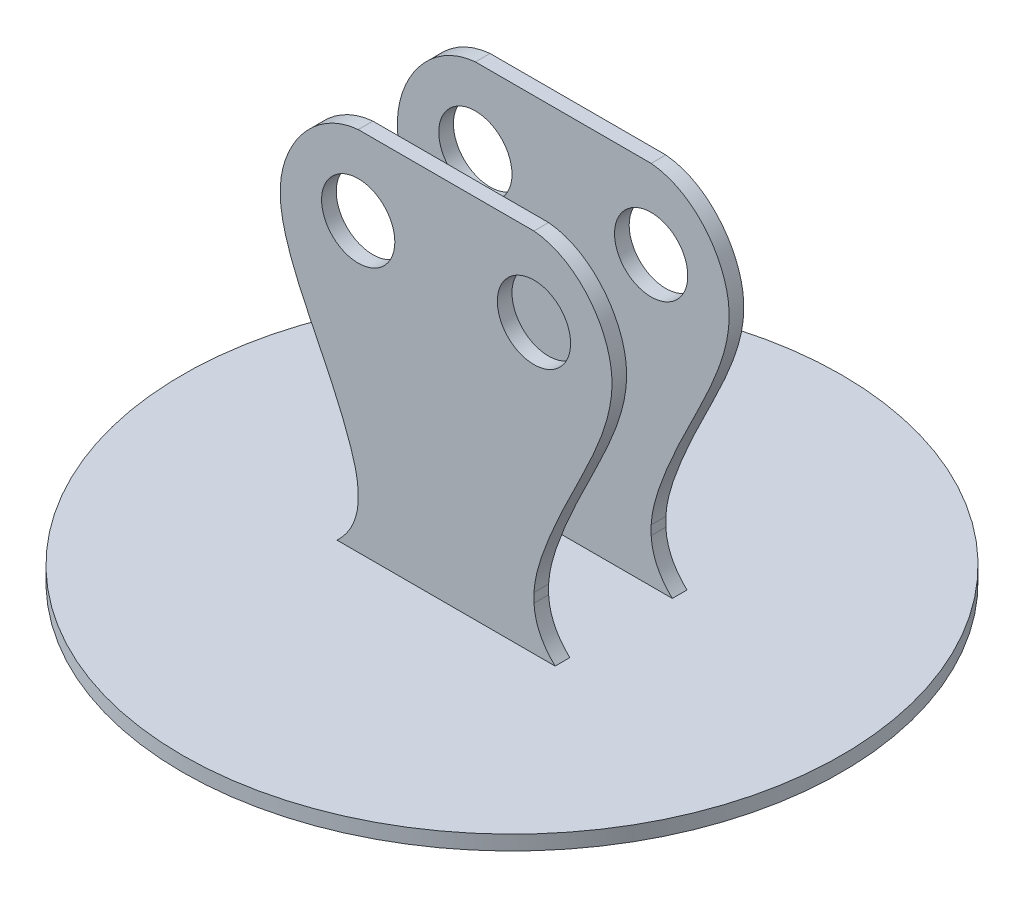
ISO-10303-21;
HEADER;
FILE_DESCRIPTION(('STEP AP214'),'2;1');
FILE_NAME('part.step','',(''),(''),'','','');
FILE_SCHEMA(('AUTOMOTIVE_DESIGN { 1 0 10303 214 1 1 1 1 }'));
ENDSEC;
DATA;
#1=APPLICATION_CONTEXT('core data for automotive mechanical design processes');
#2=APPLICATION_PROTOCOL_DEFINITION('international standard','automotive_design',2000,#1);
#3=PRODUCT_CONTEXT('',#1,'mechanical');
#4=PRODUCT('Part','Part','',(#3));
#5=PRODUCT_RELATED_PRODUCT_CATEGORY('part','',(#4));
#6=PRODUCT_DEFINITION_FORMATION('','',#4);
#7=PRODUCT_DEFINITION_CONTEXT('part definition',#1,'design');
#8=PRODUCT_DEFINITION('design','',#6,#7);
#9=PRODUCT_DEFINITION_SHAPE('','',#8);
#10=(LENGTH_UNIT() NAMED_UNIT(*) SI_UNIT(.MILLI.,.METRE.));
#11=(NAMED_UNIT(*) PLANE_ANGLE_UNIT() SI_UNIT($,.RADIAN.));
#12=(NAMED_UNIT(*) SI_UNIT($,.STERADIAN.) SOLID_ANGLE_UNIT());
#13=UNCERTAINTY_MEASURE_WITH_UNIT(LENGTH_MEASURE(1.E-05),#10,'distance_accuracy_value','');
#14=(GEOMETRIC_REPRESENTATION_CONTEXT(3) GLOBAL_UNCERTAINTY_ASSIGNED_CONTEXT((#13)) GLOBAL_UNIT_ASSIGNED_CONTEXT((#10,
#11,#12)) REPRESENTATION_CONTEXT('',''));
#15=CARTESIAN_POINT('',(0.,0.,0.));
#16=DIRECTION('',(0.,0.,1.));
#17=DIRECTION('',(1.,0.,0.));
#18=AXIS2_PLACEMENT_3D('',#15,#16,#17);
#19=CARTESIAN_POINT('',(0.,2.,0.));
#20=DIRECTION('',(0.,1.,0.));
#21=DIRECTION('',(0.,0.,1.));
#22=AXIS2_PLACEMENT_3D('',#19,#20,#21);
#23=PLANE('',#22);
#24=DIRECTION('',(0.,0.,-1.));
#25=VECTOR('',#24,1.);
#26=CARTESIAN_POINT('',(-14.891007750703,2.,37.4688038063138));
#27=LINE('',#26,#25);
#28=CARTESIAN_POINT('',(-14.891007750703,2.,-7.));
#29=VERTEX_POINT('',#28);
#30=CARTESIAN_POINT('',(-14.891007750703,2.,-9.));
#31=VERTEX_POINT('',#30);
#32=EDGE_CURVE('E63',#29,#31,#27,.T.);
#33=ORIENTED_EDGE('',*,*,#32,.T.);
#34=DIRECTION('',(-1.,0.,0.));
#35=VECTOR('',#34,1.);
#36=CARTESIAN_POINT('',(0.,2.,-9.));
#37=LINE('',#36,#35);
#38=CARTESIAN_POINT('',(14.891007750703,2.,-8.99999999999999));
#39=VERTEX_POINT('',#38);
#40=EDGE_CURVE('E296',#39,#31,#37,.T.);
#41=ORIENTED_EDGE('',*,*,#40,.F.);
#42=DIRECTION('',(0.,0.,-1.));
#43=VECTOR('',#42,1.);
#44=CARTESIAN_POINT('',(14.8910077507029,2.,37.4688038063138));
#45=LINE('',#44,#43);
#46=CARTESIAN_POINT('',(14.891007750703,2.,-6.99999999999999));
#47=VERTEX_POINT('',#46);
#48=EDGE_CURVE('E186',#47,#39,#45,.T.);
#49=ORIENTED_EDGE('',*,*,#48,.F.);
#50=DIRECTION('',(-1.,0.,0.));
#51=VECTOR('',#50,1.);
#52=CARTESIAN_POINT('',(0.,2.,-7.));
#53=LINE('',#52,#51);
#54=EDGE_CURVE('E58',#47,#29,#53,.T.);
#55=ORIENTED_EDGE('',*,*,#54,.T.);
#56=EDGE_LOOP('',(#33,#41,#49,#55));
#57=FACE_BOUND('',#56,.T.);
#58=CARTESIAN_POINT('',(0.,2.,0.));
#59=DIRECTION('',(0.,1.,0.));
#60=DIRECTION('',(0.,0.,1.));
#61=AXIS2_PLACEMENT_3D('',#58,#59,#60);
#62=CIRCLE('',#61,45.);
#63=CARTESIAN_POINT('',(0.,2.,45.));
#64=VERTEX_POINT('',#63);
#65=EDGE_CURVE('E11',#64,#64,#62,.T.);
#66=ORIENTED_EDGE('',*,*,#65,.T.);
#67=EDGE_LOOP('',(#66));
#68=FACE_BOUND('',#67,.T.);
#69=DIRECTION('',(-1.,0.,0.));
#70=VECTOR('',#69,1.);
#71=CARTESIAN_POINT('',(0.,2.,7.));
#72=LINE('',#71,#70);
#73=CARTESIAN_POINT('',(14.891007750703,2.,6.99999999999999));
#74=VERTEX_POINT('',#73);
#75=CARTESIAN_POINT('',(-14.891007750703,2.,7.));
#76=VERTEX_POINT('',#75);
#77=EDGE_CURVE('E454',#74,#76,#72,.T.);
#78=ORIENTED_EDGE('',*,*,#77,.F.);
#79=DIRECTION('',(0.,0.,1.));
#80=VECTOR('',#79,1.);
#81=CARTESIAN_POINT('',(14.8910077507029,2.,-37.4688038063138));
#82=LINE('',#81,#80);
#83=CARTESIAN_POINT('',(14.891007750703,2.,8.99999999999999));
#84=VERTEX_POINT('',#83);
#85=EDGE_CURVE('E356',#74,#84,#82,.T.);
#86=ORIENTED_EDGE('',*,*,#85,.T.);
#87=DIRECTION('',(-1.,0.,0.));
#88=VECTOR('',#87,1.);
#89=CARTESIAN_POINT('',(0.,2.,9.));
#90=LINE('',#89,#88);
#91=CARTESIAN_POINT('',(-14.891007750703,2.,9.));
#92=VERTEX_POINT('',#91);
#93=EDGE_CURVE('E447',#84,#92,#90,.T.);
#94=ORIENTED_EDGE('',*,*,#93,.T.);
#95=DIRECTION('',(0.,0.,1.));
#96=VECTOR('',#95,1.);
#97=CARTESIAN_POINT('',(-14.891007750703,2.,-37.4688038063138));
#98=LINE('',#97,#96);
#99=EDGE_CURVE('E428',#76,#92,#98,.T.);
#100=ORIENTED_EDGE('',*,*,#99,.F.);
#101=EDGE_LOOP('',(#78,#86,#94,#100));
#102=FACE_BOUND('',#101,.T.);
#103=ADVANCED_FACE('F43',(#57,#68,#102),#23,.T.);
#104=CARTESIAN_POINT('',(0.,2.,0.));
#105=DIRECTION('',(0.,-1.,0.));
#106=DIRECTION('',(0.,0.,-1.));
#107=AXIS2_PLACEMENT_3D('',#104,#105,#106);
#108=CYLINDRICAL_SURFACE('',#107,45.);
#109=ORIENTED_EDGE('',*,*,#65,.F.);
#110=EDGE_LOOP('',(#109));
#111=FACE_BOUND('',#110,.T.);
#112=CARTESIAN_POINT('',(0.,0.,0.));
#113=DIRECTION('',(0.,1.,0.));
#114=DIRECTION('',(0.,0.,1.));
#115=AXIS2_PLACEMENT_3D('',#112,#113,#114);
#116=CIRCLE('',#115,45.);
#117=CARTESIAN_POINT('',(0.,0.,45.));
#118=VERTEX_POINT('',#117);
#119=EDGE_CURVE('E47',#118,#118,#116,.T.);
#120=ORIENTED_EDGE('',*,*,#119,.T.);
#121=EDGE_LOOP('',(#120));
#122=FACE_BOUND('',#121,.T.);
#123=ADVANCED_FACE('F45',(#111,#122),#108,.T.);
#124=CARTESIAN_POINT('',(0.,0.,0.));
#125=DIRECTION('',(0.,1.,0.));
#126=DIRECTION('',(0.,0.,1.));
#127=AXIS2_PLACEMENT_3D('',#124,#125,#126);
#128=PLANE('',#127);
#129=ORIENTED_EDGE('',*,*,#119,.F.);
#130=EDGE_LOOP('',(#129));
#131=FACE_BOUND('',#130,.T.);
#132=ADVANCED_FACE('F468',(#131),#128,.F.);
#133=CARTESIAN_POINT('',(0.,52.,7.));
#134=DIRECTION('',(0.,0.,1.));
#135=DIRECTION('',(1.,0.,0.));
#136=AXIS2_PLACEMENT_3D('',#133,#134,#135);
#137=PLANE('',#136);
#138=CARTESIAN_POINT('',(-12.,41.2016468073082,7.));
#139=DIRECTION('',(0.,0.,1.));
#140=DIRECTION('',(1.,0.,0.));
#141=AXIS2_PLACEMENT_3D('',#138,#139,#140);
#142=CIRCLE('',#141,5.);
#143=CARTESIAN_POINT('',(-7.,41.2016468073082,7.));
#144=VERTEX_POINT('',#143);
#145=EDGE_CURVE('E384',#144,#144,#142,.T.);
#146=ORIENTED_EDGE('',*,*,#145,.T.);
#147=EDGE_LOOP('',(#146));
#148=FACE_BOUND('',#147,.T.);
#149=ORIENTED_EDGE('',*,*,#77,.T.);
#150=CARTESIAN_POINT('',(-12.,52.,7.));
#151=CARTESIAN_POINT('',(-17.7076082734,51.5000795332923,7.));
#152=CARTESIAN_POINT('',(-24.2528807765385,43.2597323463657,7.));
#153=CARTESIAN_POINT('',(-21.3975400761616,31.962524142188,7.));
#154=CARTESIAN_POINT('',(-17.3388050300587,23.9745086455927,7.));
#155=CARTESIAN_POINT('',(-12.6520814833312,14.2021610637252,7.));
#156=CARTESIAN_POINT('',(-10.6555339458755,6.01314104208462,7.));
#157=CARTESIAN_POINT('',(-14.891007750703,2.,7.));
#158=B_SPLINE_CURVE_WITH_KNOTS('',3,(#150,#151,#152,#153,#154,#155,#156,#157),.UNSPECIFIED.,.F.,
.F.,(4,1,1,1,1,4),(0.,0.287980079795971,0.430455664091535,0.586456404950871,0.756216635006292,
1.),.UNSPECIFIED.);
#159=CARTESIAN_POINT('',(-12.,7.97972563222294,7.));
#160=VERTEX_POINT('',#159);
#161=EDGE_CURVE('E434',#76,#160,#158,.F.);
#162=ORIENTED_EDGE('',*,*,#161,.T.);
#163=DIRECTION('',(0.,-1.,0.));
#164=VECTOR('',#163,1.);
#165=CARTESIAN_POINT('',(-12.,52.,7.));
#166=LINE('',#165,#164);
#167=CARTESIAN_POINT('',(-12.,9.25258575492129,7.));
#168=VERTEX_POINT('',#167);
#169=EDGE_CURVE('E459',#168,#160,#166,.T.);
#170=ORIENTED_EDGE('',*,*,#169,.F.);
#171=CARTESIAN_POINT('',(-12.,52.,7.));
#172=CARTESIAN_POINT('',(-17.7076082734,51.5000795332923,7.));
#173=CARTESIAN_POINT('',(-24.2528807765385,43.2597323463657,7.));
#174=CARTESIAN_POINT('',(-21.3975400761616,31.962524142188,7.));
#175=CARTESIAN_POINT('',(-17.3388050300587,23.9745086455927,7.));
#176=CARTESIAN_POINT('',(-12.6520814833312,14.2021610637252,7.));
#177=CARTESIAN_POINT('',(-10.6555339458755,6.01314104208462,7.));
#178=CARTESIAN_POINT('',(-14.891007750703,2.,7.));
#179=B_SPLINE_CURVE_WITH_KNOTS('',3,(#171,#172,#173,#174,#175,#176,#177,#178),.UNSPECIFIED.,.F.,
.F.,(4,1,1,1,1,4),(0.,0.287980079795971,0.430455664091535,0.586456404950871,0.756216635006292,
1.),.UNSPECIFIED.);
#180=CARTESIAN_POINT('',(-12.,52.,7.));
#181=VERTEX_POINT('',#180);
#182=EDGE_CURVE('E417',#168,#181,#179,.F.);
#183=ORIENTED_EDGE('',*,*,#182,.T.);
#184=DIRECTION('',(-1.,0.,0.));
#185=VECTOR('',#184,1.);
#186=CARTESIAN_POINT('',(0.,52.,7.));
#187=LINE('',#186,#185);
#188=CARTESIAN_POINT('',(12.,52.,7.));
#189=VERTEX_POINT('',#188);
#190=EDGE_CURVE('E440',#189,#181,#187,.T.);
#191=ORIENTED_EDGE('',*,*,#190,.F.);
#192=CARTESIAN_POINT('',(12.,52.,7.));
#193=CARTESIAN_POINT('',(17.7076082734,51.5000795332923,6.99999999999999));
#194=CARTESIAN_POINT('',(24.2528807765385,43.2597323463657,6.99999999999999));
#195=CARTESIAN_POINT('',(21.3975400761616,31.962524142188,6.99999999999999));
#196=CARTESIAN_POINT('',(17.3388050300587,23.9745086455927,6.99999999999999));
#197=CARTESIAN_POINT('',(12.6520814833312,14.2021610637252,7.));
#198=CARTESIAN_POINT('',(10.6555339458755,6.01314104208462,7.));
#199=CARTESIAN_POINT('',(14.891007750703,2.,7.));
#200=B_SPLINE_CURVE_WITH_KNOTS('',3,(#192,#193,#194,#195,#196,#197,#198,#199),.UNSPECIFIED.,.F.,
.F.,(4,1,1,1,1,4),(0.,0.287980079795971,0.430455664091535,0.586456404950871,0.756216635006292,
1.),.UNSPECIFIED.);
#201=CARTESIAN_POINT('',(12.,9.25258575492129,7.));
#202=VERTEX_POINT('',#201);
#203=EDGE_CURVE('E345',#202,#189,#200,.F.);
#204=ORIENTED_EDGE('',*,*,#203,.F.);
#205=DIRECTION('',(0.,-1.,0.));
#206=VECTOR('',#205,1.);
#207=CARTESIAN_POINT('',(12.,52.,7.));
#208=LINE('',#207,#206);
#209=CARTESIAN_POINT('',(12.,7.97972563222294,7.));
#210=VERTEX_POINT('',#209);
#211=EDGE_CURVE('E378',#202,#210,#208,.T.);
#212=ORIENTED_EDGE('',*,*,#211,.T.);
#213=CARTESIAN_POINT('',(12.,52.,7.));
#214=CARTESIAN_POINT('',(17.7076082734,51.5000795332923,6.99999999999999));
#215=CARTESIAN_POINT('',(24.2528807765385,43.2597323463657,6.99999999999999));
#216=CARTESIAN_POINT('',(21.3975400761616,31.962524142188,6.99999999999999));
#217=CARTESIAN_POINT('',(17.3388050300587,23.9745086455927,6.99999999999999));
#218=CARTESIAN_POINT('',(12.6520814833312,14.2021610637252,7.));
#219=CARTESIAN_POINT('',(10.6555339458755,6.01314104208462,7.));
#220=CARTESIAN_POINT('',(14.891007750703,2.,7.));
#221=B_SPLINE_CURVE_WITH_KNOTS('',3,(#213,#214,#215,#216,#217,#218,#219,#220),.UNSPECIFIED.,.F.,
.F.,(4,1,1,1,1,4),(0.,0.287980079795971,0.430455664091535,0.586456404950871,0.756216635006292,
1.),.UNSPECIFIED.);
#222=EDGE_CURVE('E362',#74,#210,#221,.F.);
#223=ORIENTED_EDGE('',*,*,#222,.F.);
#224=EDGE_LOOP('',(#149,#162,#170,#183,#191,#204,#212,#223));
#225=FACE_BOUND('',#224,.T.);
#226=CARTESIAN_POINT('',(12.,41.2016468073082,7.));
#227=DIRECTION('',(0.,0.,-1.));
#228=DIRECTION('',(-1.,0.,0.));
#229=AXIS2_PLACEMENT_3D('',#226,#227,#228);
#230=CIRCLE('',#229,5.);
#231=CARTESIAN_POINT('',(7.,41.2016468073082,7.));
#232=VERTEX_POINT('',#231);
#233=EDGE_CURVE('E310',#232,#232,#230,.T.);
#234=ORIENTED_EDGE('',*,*,#233,.F.);
#235=EDGE_LOOP('',(#234));
#236=FACE_BOUND('',#235,.T.);
#237=ADVANCED_FACE('F470',(#148,#225,#236),#137,.F.);
#238=CARTESIAN_POINT('',(-12.,52.,0.));
#239=DIRECTION('',(1.,0.,0.));
#240=DIRECTION('',(0.,0.,-1.));
#241=AXIS2_PLACEMENT_3D('',#238,#239,#240);
#242=PLANE('',#241);
#243=DIRECTION('',(0.,-1.,0.));
#244=VECTOR('',#243,1.);
#245=CARTESIAN_POINT('',(-12.,52.,9.));
#246=LINE('',#245,#244);
#247=CARTESIAN_POINT('',(-12.,9.25258575492129,9.));
#248=VERTEX_POINT('',#247);
#249=CARTESIAN_POINT('',(-12.,7.97972563222292,9.));
#250=VERTEX_POINT('',#249);
#251=EDGE_CURVE('E453',#248,#250,#246,.T.);
#252=ORIENTED_EDGE('',*,*,#251,.F.);
#253=DIRECTION('',(0.,0.,1.));
#254=VECTOR('',#253,1.);
#255=CARTESIAN_POINT('',(-12.,9.25258575492129,-37.4688038063138));
#256=LINE('',#255,#254);
#257=EDGE_CURVE('E772',#168,#248,#256,.T.);
#258=ORIENTED_EDGE('',*,*,#257,.F.);
#259=ORIENTED_EDGE('',*,*,#169,.T.);
#260=DIRECTION('',(0.,0.,1.));
#261=VECTOR('',#260,1.);
#262=CARTESIAN_POINT('',(-12.,7.97972563222292,-37.4688038063138));
#263=LINE('',#262,#261);
#264=EDGE_CURVE('E427',#160,#250,#263,.T.);
#265=ORIENTED_EDGE('',*,*,#264,.T.);
#266=EDGE_LOOP('',(#252,#258,#259,#265));
#267=FACE_BOUND('',#266,.T.);
#268=ADVANCED_FACE('F475',(#267),#242,.F.);
#269=CARTESIAN_POINT('',(0.,52.,9.));
#270=DIRECTION('',(0.,0.,1.));
#271=DIRECTION('',(1.,0.,0.));
#272=AXIS2_PLACEMENT_3D('',#269,#270,#271);
#273=PLANE('',#272);
#274=CARTESIAN_POINT('',(-12.,41.2016468073082,9.));
#275=DIRECTION('',(0.,0.,1.));
#276=DIRECTION('',(1.,0.,0.));
#277=AXIS2_PLACEMENT_3D('',#274,#275,#276);
#278=CIRCLE('',#277,5.);
#279=CARTESIAN_POINT('',(-7.,41.2016468073082,9.));
#280=VERTEX_POINT('',#279);
#281=EDGE_CURVE('E381',#280,#280,#278,.T.);
#282=ORIENTED_EDGE('',*,*,#281,.F.);
#283=EDGE_LOOP('',(#282));
#284=FACE_BOUND('',#283,.T.);
#285=ORIENTED_EDGE('',*,*,#93,.F.);
#286=CARTESIAN_POINT('',(12.,52.,9.));
#287=CARTESIAN_POINT('',(17.7076082734,51.5000795332923,9.));
#288=CARTESIAN_POINT('',(24.2528807765385,43.2597323463657,9.));
#289=CARTESIAN_POINT('',(21.3975400761616,31.962524142188,9.));
#290=CARTESIAN_POINT('',(17.3388050300587,23.9745086455927,9.));
#291=CARTESIAN_POINT('',(12.6520814833312,14.2021610637252,9.));
#292=CARTESIAN_POINT('',(10.6555339458755,6.01314104208462,9.));
#293=CARTESIAN_POINT('',(14.891007750703,2.,9.));
#294=B_SPLINE_CURVE_WITH_KNOTS('',3,(#286,#287,#288,#289,#290,#291,#292,#293),.UNSPECIFIED.,.F.,
.F.,(4,1,1,1,1,4),(0.,0.287980079795971,0.430455664091535,0.586456404950871,0.756216635006292,
1.),.UNSPECIFIED.);
#295=CARTESIAN_POINT('',(12.,7.97972563222292,9.));
#296=VERTEX_POINT('',#295);
#297=EDGE_CURVE('E313',#296,#84,#294,.T.);
#298=ORIENTED_EDGE('',*,*,#297,.F.);
#299=DIRECTION('',(0.,-1.,0.));
#300=VECTOR('',#299,1.);
#301=CARTESIAN_POINT('',(12.,52.,9.));
#302=LINE('',#301,#300);
#303=CARTESIAN_POINT('',(12.,9.25258575492129,9.));
#304=VERTEX_POINT('',#303);
#305=EDGE_CURVE('E375',#304,#296,#302,.T.);
#306=ORIENTED_EDGE('',*,*,#305,.F.);
#307=CARTESIAN_POINT('',(12.,52.,9.));
#308=CARTESIAN_POINT('',(17.7076082734,51.5000795332923,9.));
#309=CARTESIAN_POINT('',(24.2528807765385,43.2597323463657,9.));
#310=CARTESIAN_POINT('',(21.3975400761616,31.962524142188,9.));
#311=CARTESIAN_POINT('',(17.3388050300587,23.9745086455927,9.));
#312=CARTESIAN_POINT('',(12.6520814833312,14.2021610637252,9.));
#313=CARTESIAN_POINT('',(10.6555339458755,6.01314104208462,9.));
#314=CARTESIAN_POINT('',(14.891007750703,2.,9.));
#315=B_SPLINE_CURVE_WITH_KNOTS('',3,(#307,#308,#309,#310,#311,#312,#313,#314),.UNSPECIFIED.,.F.,
.F.,(4,1,1,1,1,4),(0.,0.287980079795971,0.430455664091535,0.586456404950871,0.756216635006292,
1.),.UNSPECIFIED.);
#316=CARTESIAN_POINT('',(12.,52.,9.));
#317=VERTEX_POINT('',#316);
#318=EDGE_CURVE('E318',#317,#304,#315,.T.);
#319=ORIENTED_EDGE('',*,*,#318,.F.);
#320=DIRECTION('',(-1.,0.,0.));
#321=VECTOR('',#320,1.);
#322=CARTESIAN_POINT('',(0.,52.,9.));
#323=LINE('',#322,#321);
#324=CARTESIAN_POINT('',(-12.,52.,9.));
#325=VERTEX_POINT('',#324);
#326=EDGE_CURVE('E450',#317,#325,#323,.T.);
#327=ORIENTED_EDGE('',*,*,#326,.T.);
#328=CARTESIAN_POINT('',(-12.,52.,9.));
#329=CARTESIAN_POINT('',(-17.7076082734,51.5000795332923,9.));
#330=CARTESIAN_POINT('',(-24.2528807765385,43.2597323463657,9.));
#331=CARTESIAN_POINT('',(-21.3975400761616,31.962524142188,9.));
#332=CARTESIAN_POINT('',(-17.3388050300587,23.9745086455927,9.));
#333=CARTESIAN_POINT('',(-12.6520814833312,14.2021610637252,9.));
#334=CARTESIAN_POINT('',(-10.6555339458755,6.01314104208462,9.));
#335=CARTESIAN_POINT('',(-14.891007750703,2.,9.));
#336=B_SPLINE_CURVE_WITH_KNOTS('',3,(#328,#329,#330,#331,#332,#333,#334,#335),.UNSPECIFIED.,.F.,
.F.,(4,1,1,1,1,4),(0.,0.287980079795971,0.430455664091535,0.586456404950871,0.756216635006292,
1.),.UNSPECIFIED.);
#337=EDGE_CURVE('E392',#325,#248,#336,.T.);
#338=ORIENTED_EDGE('',*,*,#337,.T.);
#339=ORIENTED_EDGE('',*,*,#251,.T.);
#340=CARTESIAN_POINT('',(-12.,52.,9.));
#341=CARTESIAN_POINT('',(-17.7076082734,51.5000795332923,9.));
#342=CARTESIAN_POINT('',(-24.2528807765385,43.2597323463657,9.));
#343=CARTESIAN_POINT('',(-21.3975400761616,31.962524142188,9.));
#344=CARTESIAN_POINT('',(-17.3388050300587,23.9745086455927,9.));
#345=CARTESIAN_POINT('',(-12.6520814833312,14.2021610637252,9.));
#346=CARTESIAN_POINT('',(-10.6555339458755,6.01314104208462,9.));
#347=CARTESIAN_POINT('',(-14.891007750703,2.,9.));
#348=B_SPLINE_CURVE_WITH_KNOTS('',3,(#340,#341,#342,#343,#344,#345,#346,#347),.UNSPECIFIED.,.F.,
.F.,(4,1,1,1,1,4),(0.,0.287980079795971,0.430455664091535,0.586456404950871,0.756216635006292,
1.),.UNSPECIFIED.);
#349=EDGE_CURVE('E387',#250,#92,#348,.T.);
#350=ORIENTED_EDGE('',*,*,#349,.T.);
#351=EDGE_LOOP('',(#285,#298,#306,#319,#327,#338,#339,#350));
#352=FACE_BOUND('',#351,.T.);
#353=CARTESIAN_POINT('',(12.,41.2016468073082,9.));
#354=DIRECTION('',(0.,0.,-1.));
#355=DIRECTION('',(-1.,0.,0.));
#356=AXIS2_PLACEMENT_3D('',#353,#354,#355);
#357=CIRCLE('',#356,5.);
#358=CARTESIAN_POINT('',(7.,41.2016468073082,9.));
#359=VERTEX_POINT('',#358);
#360=EDGE_CURVE('E307',#359,#359,#357,.T.);
#361=ORIENTED_EDGE('',*,*,#360,.T.);
#362=EDGE_LOOP('',(#361));
#363=FACE_BOUND('',#362,.T.);
#364=ADVANCED_FACE('F489',(#284,#352,#363),#273,.T.);
#365=CARTESIAN_POINT('',(0.,52.,0.));
#366=DIRECTION('',(0.,1.,0.));
#367=DIRECTION('',(0.,0.,1.));
#368=AXIS2_PLACEMENT_3D('',#365,#366,#367);
#369=PLANE('',#368);
#370=ORIENTED_EDGE('',*,*,#190,.T.);
#371=DIRECTION('',(0.,0.,1.));
#372=VECTOR('',#371,1.);
#373=CARTESIAN_POINT('',(-12.,52.,0.));
#374=LINE('',#373,#372);
#375=EDGE_CURVE('E446',#181,#325,#374,.T.);
#376=ORIENTED_EDGE('',*,*,#375,.T.);
#377=ORIENTED_EDGE('',*,*,#326,.F.);
#378=DIRECTION('',(0.,0.,1.));
#379=VECTOR('',#378,1.);
#380=CARTESIAN_POINT('',(12.,52.,0.));
#381=LINE('',#380,#379);
#382=EDGE_CURVE('E369',#189,#317,#381,.T.);
#383=ORIENTED_EDGE('',*,*,#382,.F.);
#384=EDGE_LOOP('',(#370,#376,#377,#383));
#385=FACE_BOUND('',#384,.T.);
#386=ADVANCED_FACE('F404',(#385),#369,.T.);
#387=CARTESIAN_POINT('',(-12.,52.,-37.4688038063138));
#388=CARTESIAN_POINT('',(-17.7076082734,51.5000795332923,-37.4688038063138));
#389=CARTESIAN_POINT('',(-24.2528807765385,43.2597323463657,-37.4688038063138));
#390=CARTESIAN_POINT('',(-21.3975400761616,31.962524142188,-37.4688038063138));
#391=CARTESIAN_POINT('',(-17.3388050300587,23.9745086455927,-37.4688038063138));
#392=CARTESIAN_POINT('',(-12.6520814833312,14.2021610637252,-37.4688038063138));
#393=CARTESIAN_POINT('',(-10.6555339458755,6.01314104208462,-37.4688038063138));
#394=CARTESIAN_POINT('',(-14.891007750703,2.,-37.4688038063138));
#395=B_SPLINE_CURVE_WITH_KNOTS('',3,(#387,#388,#389,#390,#391,#392,#393,#394),.UNSPECIFIED.,.F.,
.F.,(4,1,1,1,1,4),(0.,0.287980079795971,0.430455664091535,0.586456404950871,0.756216635006292,
1.),.UNSPECIFIED.);
#396=DIRECTION('',(0.,0.,1.));
#397=VECTOR('',#396,1.);
#398=SURFACE_OF_LINEAR_EXTRUSION('',#395,#397);
#399=ORIENTED_EDGE('',*,*,#182,.F.);
#400=ORIENTED_EDGE('',*,*,#257,.T.);
#401=ORIENTED_EDGE('',*,*,#337,.F.);
#402=ORIENTED_EDGE('',*,*,#375,.F.);
#403=EDGE_LOOP('',(#399,#400,#401,#402));
#404=FACE_BOUND('',#403,.T.);
#405=ADVANCED_FACE('F400',(#404),#398,.T.);
#406=CARTESIAN_POINT('',(-12.,52.,-37.4688038063138));
#407=CARTESIAN_POINT('',(-17.7076082734,51.5000795332923,-37.4688038063138));
#408=CARTESIAN_POINT('',(-24.2528807765385,43.2597323463657,-37.4688038063138));
#409=CARTESIAN_POINT('',(-21.3975400761616,31.962524142188,-37.4688038063138));
#410=CARTESIAN_POINT('',(-17.3388050300587,23.9745086455927,-37.4688038063138));
#411=CARTESIAN_POINT('',(-12.6520814833312,14.2021610637252,-37.4688038063138));
#412=CARTESIAN_POINT('',(-10.6555339458755,6.01314104208462,-37.4688038063138));
#413=CARTESIAN_POINT('',(-14.891007750703,2.,-37.4688038063138));
#414=B_SPLINE_CURVE_WITH_KNOTS('',3,(#406,#407,#408,#409,#410,#411,#412,#413),.UNSPECIFIED.,.F.,
.F.,(4,1,1,1,1,4),(0.,0.287980079795971,0.430455664091535,0.586456404950871,0.756216635006292,
1.),.UNSPECIFIED.);
#415=DIRECTION('',(0.,0.,1.));
#416=VECTOR('',#415,1.);
#417=SURFACE_OF_LINEAR_EXTRUSION('',#414,#416);
#418=ORIENTED_EDGE('',*,*,#161,.F.);
#419=ORIENTED_EDGE('',*,*,#99,.T.);
#420=ORIENTED_EDGE('',*,*,#349,.F.);
#421=ORIENTED_EDGE('',*,*,#264,.F.);
#422=EDGE_LOOP('',(#418,#419,#420,#421));
#423=FACE_BOUND('',#422,.T.);
#424=ADVANCED_FACE('F403',(#423),#417,.T.);
#425=CARTESIAN_POINT('',(-12.,41.2016468073082,-41.));
#426=DIRECTION('',(0.,0.,1.));
#427=DIRECTION('',(1.,0.,0.));
#428=AXIS2_PLACEMENT_3D('',#425,#426,#427);
#429=CYLINDRICAL_SURFACE('',#428,5.);
#430=ORIENTED_EDGE('',*,*,#281,.T.);
#431=EDGE_LOOP('',(#430));
#432=FACE_BOUND('',#431,.T.);
#433=ORIENTED_EDGE('',*,*,#145,.F.);
#434=EDGE_LOOP('',(#433));
#435=FACE_BOUND('',#434,.T.);
#436=ADVANCED_FACE('F406',(#432,#435),#429,.F.);
#437=CARTESIAN_POINT('',(12.,52.,0.));
#438=DIRECTION('',(-1.,0.,0.));
#439=DIRECTION('',(0.,0.,-1.));
#440=AXIS2_PLACEMENT_3D('',#437,#438,#439);
#441=PLANE('',#440);
#442=ORIENTED_EDGE('',*,*,#305,.T.);
#443=DIRECTION('',(0.,0.,1.));
#444=VECTOR('',#443,1.);
#445=CARTESIAN_POINT('',(12.,7.97972563222292,-37.4688038063138));
#446=LINE('',#445,#444);
#447=EDGE_CURVE('E355',#210,#296,#446,.T.);
#448=ORIENTED_EDGE('',*,*,#447,.F.);
#449=ORIENTED_EDGE('',*,*,#211,.F.);
#450=DIRECTION('',(0.,0.,1.));
#451=VECTOR('',#450,1.);
#452=CARTESIAN_POINT('',(12.,9.25258575492129,-37.4688038063138));
#453=LINE('',#452,#451);
#454=EDGE_CURVE('E765',#202,#304,#453,.T.);
#455=ORIENTED_EDGE('',*,*,#454,.T.);
#456=EDGE_LOOP('',(#442,#448,#449,#455));
#457=FACE_BOUND('',#456,.T.);
#458=ADVANCED_FACE('F331',(#457),#441,.F.);
#459=CARTESIAN_POINT('',(12.,52.,-37.4688038063138));
#460=CARTESIAN_POINT('',(17.7076082734,51.5000795332923,-37.4688038063138));
#461=CARTESIAN_POINT('',(24.2528807765385,43.2597323463657,-37.4688038063138));
#462=CARTESIAN_POINT('',(21.3975400761616,31.962524142188,-37.4688038063138));
#463=CARTESIAN_POINT('',(17.3388050300587,23.9745086455927,-37.4688038063138));
#464=CARTESIAN_POINT('',(12.6520814833312,14.2021610637252,-37.4688038063138));
#465=CARTESIAN_POINT('',(10.6555339458755,6.01314104208462,-37.4688038063138));
#466=CARTESIAN_POINT('',(14.8910077507029,2.,-37.4688038063138));
#467=B_SPLINE_CURVE_WITH_KNOTS('',3,(#459,#460,#461,#462,#463,#464,#465,#466),.UNSPECIFIED.,.F.,
.F.,(4,1,1,1,1,4),(0.,0.287980079795971,0.430455664091535,0.586456404950871,0.756216635006292,
1.),.UNSPECIFIED.);
#468=DIRECTION('',(0.,0.,1.));
#469=VECTOR('',#468,1.);
#470=SURFACE_OF_LINEAR_EXTRUSION('',#467,#469);
#471=ORIENTED_EDGE('',*,*,#203,.T.);
#472=ORIENTED_EDGE('',*,*,#382,.T.);
#473=ORIENTED_EDGE('',*,*,#318,.T.);
#474=ORIENTED_EDGE('',*,*,#454,.F.);
#475=EDGE_LOOP('',(#471,#472,#473,#474));
#476=FACE_BOUND('',#475,.T.);
#477=ADVANCED_FACE('F326',(#476),#470,.F.);
#478=CARTESIAN_POINT('',(12.,52.,-37.4688038063138));
#479=CARTESIAN_POINT('',(17.7076082734,51.5000795332923,-37.4688038063138));
#480=CARTESIAN_POINT('',(24.2528807765385,43.2597323463657,-37.4688038063138));
#481=CARTESIAN_POINT('',(21.3975400761616,31.962524142188,-37.4688038063138));
#482=CARTESIAN_POINT('',(17.3388050300587,23.9745086455927,-37.4688038063138));
#483=CARTESIAN_POINT('',(12.6520814833312,14.2021610637252,-37.4688038063138));
#484=CARTESIAN_POINT('',(10.6555339458755,6.01314104208462,-37.4688038063138));
#485=CARTESIAN_POINT('',(14.8910077507029,2.,-37.4688038063138));
#486=B_SPLINE_CURVE_WITH_KNOTS('',3,(#478,#479,#480,#481,#482,#483,#484,#485),.UNSPECIFIED.,.F.,
.F.,(4,1,1,1,1,4),(0.,0.287980079795971,0.430455664091535,0.586456404950871,0.756216635006292,
1.),.UNSPECIFIED.);
#487=DIRECTION('',(0.,0.,1.));
#488=VECTOR('',#487,1.);
#489=SURFACE_OF_LINEAR_EXTRUSION('',#486,#488);
#490=ORIENTED_EDGE('',*,*,#222,.T.);
#491=ORIENTED_EDGE('',*,*,#447,.T.);
#492=ORIENTED_EDGE('',*,*,#297,.T.);
#493=ORIENTED_EDGE('',*,*,#85,.F.);
#494=EDGE_LOOP('',(#490,#491,#492,#493));
#495=FACE_BOUND('',#494,.T.);
#496=ADVANCED_FACE('F330',(#495),#489,.F.);
#497=CARTESIAN_POINT('',(12.,41.2016468073082,-41.));
#498=DIRECTION('',(0.,0.,1.));
#499=DIRECTION('',(-1.,0.,0.));
#500=AXIS2_PLACEMENT_3D('',#497,#498,#499);
#501=CYLINDRICAL_SURFACE('',#500,5.);
#502=ORIENTED_EDGE('',*,*,#360,.F.);
#503=EDGE_LOOP('',(#502));
#504=FACE_BOUND('',#503,.T.);
#505=ORIENTED_EDGE('',*,*,#233,.T.);
#506=EDGE_LOOP('',(#505));
#507=FACE_BOUND('',#506,.T.);
#508=ADVANCED_FACE('F333',(#504,#507),#501,.F.);
#509=CARTESIAN_POINT('',(0.,52.,-7.));
#510=DIRECTION('',(0.,0.,-1.));
#511=DIRECTION('',(1.,0.,0.));
#512=AXIS2_PLACEMENT_3D('',#509,#510,#511);
#513=PLANE('',#512);
#514=CARTESIAN_POINT('',(-12.,41.2016468073082,-7.));
#515=DIRECTION('',(0.,0.,1.));
#516=DIRECTION('',(1.,0.,0.));
#517=AXIS2_PLACEMENT_3D('',#514,#515,#516);
#518=CIRCLE('',#517,5.);
#519=CARTESIAN_POINT('',(-7.,41.2016468073082,-7.));
#520=VERTEX_POINT('',#519);
#521=EDGE_CURVE('E244',#520,#520,#518,.T.);
#522=ORIENTED_EDGE('',*,*,#521,.F.);
#523=EDGE_LOOP('',(#522));
#524=FACE_BOUND('',#523,.T.);
#525=ORIENTED_EDGE('',*,*,#54,.F.);
#526=CARTESIAN_POINT('',(12.,52.,-7.));
#527=CARTESIAN_POINT('',(17.7076082734,51.5000795332923,-6.99999999999999));
#528=CARTESIAN_POINT('',(24.2528807765385,43.2597323463657,-6.99999999999999));
#529=CARTESIAN_POINT('',(21.3975400761616,31.962524142188,-6.99999999999999));
#530=CARTESIAN_POINT('',(17.3388050300587,23.9745086455927,-6.99999999999999));
#531=CARTESIAN_POINT('',(12.6520814833312,14.2021610637252,-7.));
#532=CARTESIAN_POINT('',(10.6555339458755,6.01314104208462,-7.));
#533=CARTESIAN_POINT('',(14.891007750703,2.,-7.));
#534=B_SPLINE_CURVE_WITH_KNOTS('',3,(#526,#527,#528,#529,#530,#531,#532,#533),.UNSPECIFIED.,.F.,
.F.,(4,1,1,1,1,4),(0.,0.287980079795971,0.430455664091535,0.586456404950871,0.756216635006292,
1.),.UNSPECIFIED.);
#535=CARTESIAN_POINT('',(12.,7.97972563222294,-7.));
#536=VERTEX_POINT('',#535);
#537=EDGE_CURVE('E183',#47,#536,#534,.F.);
#538=ORIENTED_EDGE('',*,*,#537,.T.);
#539=DIRECTION('',(0.,-1.,0.));
#540=VECTOR('',#539,1.);
#541=CARTESIAN_POINT('',(12.,52.,-7.));
#542=LINE('',#541,#540);
#543=CARTESIAN_POINT('',(12.,9.25258575492129,-7.));
#544=VERTEX_POINT('',#543);
#545=EDGE_CURVE('E174',#544,#536,#542,.T.);
#546=ORIENTED_EDGE('',*,*,#545,.F.);
#547=CARTESIAN_POINT('',(12.,52.,-7.));
#548=CARTESIAN_POINT('',(17.7076082734,51.5000795332923,-6.99999999999999));
#549=CARTESIAN_POINT('',(24.2528807765385,43.2597323463657,-6.99999999999999));
#550=CARTESIAN_POINT('',(21.3975400761616,31.962524142188,-6.99999999999999));
#551=CARTESIAN_POINT('',(17.3388050300587,23.9745086455927,-6.99999999999999));
#552=CARTESIAN_POINT('',(12.6520814833312,14.2021610637252,-7.));
#553=CARTESIAN_POINT('',(10.6555339458755,6.01314104208462,-7.));
#554=CARTESIAN_POINT('',(14.891007750703,2.,-7.));
#555=B_SPLINE_CURVE_WITH_KNOTS('',3,(#547,#548,#549,#550,#551,#552,#553,#554),.UNSPECIFIED.,.F.,
.F.,(4,1,1,1,1,4),(0.,0.287980079795971,0.430455664091535,0.586456404950871,0.756216635006292,
1.),.UNSPECIFIED.);
#556=CARTESIAN_POINT('',(12.,52.,-7.));
#557=VERTEX_POINT('',#556);
#558=EDGE_CURVE('E162',#544,#557,#555,.F.);
#559=ORIENTED_EDGE('',*,*,#558,.T.);
#560=DIRECTION('',(-1.,0.,0.));
#561=VECTOR('',#560,1.);
#562=CARTESIAN_POINT('',(0.,52.,-7.));
#563=LINE('',#562,#561);
#564=CARTESIAN_POINT('',(-12.,52.,-7.));
#565=VERTEX_POINT('',#564);
#566=EDGE_CURVE('E289',#557,#565,#563,.T.);
#567=ORIENTED_EDGE('',*,*,#566,.T.);
#568=CARTESIAN_POINT('',(-12.,52.,-7.));
#569=CARTESIAN_POINT('',(-17.7076082734,51.5000795332923,-7.));
#570=CARTESIAN_POINT('',(-24.2528807765385,43.2597323463657,-7.));
#571=CARTESIAN_POINT('',(-21.3975400761616,31.962524142188,-7.));
#572=CARTESIAN_POINT('',(-17.3388050300587,23.9745086455927,-7.));
#573=CARTESIAN_POINT('',(-12.6520814833312,14.2021610637252,-7.));
#574=CARTESIAN_POINT('',(-10.6555339458755,6.01314104208462,-7.));
#575=CARTESIAN_POINT('',(-14.891007750703,2.,-7.));
#576=B_SPLINE_CURVE_WITH_KNOTS('',3,(#568,#569,#570,#571,#572,#573,#574,#575),.UNSPECIFIED.,.F.,
.F.,(4,1,1,1,1,4),(0.,0.287980079795971,0.430455664091535,0.586456404950871,0.756216635006292,
1.),.UNSPECIFIED.);
#577=CARTESIAN_POINT('',(-12.,9.25258575492129,-7.));
#578=VERTEX_POINT('',#577);
#579=EDGE_CURVE('E260',#578,#565,#576,.F.);
#580=ORIENTED_EDGE('',*,*,#579,.F.);
#581=DIRECTION('',(0.,-1.,0.));
#582=VECTOR('',#581,1.);
#583=CARTESIAN_POINT('',(-12.,52.,-7.));
#584=LINE('',#583,#582);
#585=CARTESIAN_POINT('',(-12.,7.97972563222294,-7.));
#586=VERTEX_POINT('',#585);
#587=EDGE_CURVE('E304',#578,#586,#584,.T.);
#588=ORIENTED_EDGE('',*,*,#587,.T.);
#589=CARTESIAN_POINT('',(-12.,52.,-7.));
#590=CARTESIAN_POINT('',(-17.7076082734,51.5000795332923,-7.));
#591=CARTESIAN_POINT('',(-24.2528807765385,43.2597323463657,-7.));
#592=CARTESIAN_POINT('',(-21.3975400761616,31.962524142188,-7.));
#593=CARTESIAN_POINT('',(-17.3388050300587,23.9745086455927,-7.));
#594=CARTESIAN_POINT('',(-12.6520814833312,14.2021610637252,-7.));
#595=CARTESIAN_POINT('',(-10.6555339458755,6.01314104208462,-7.));
#596=CARTESIAN_POINT('',(-14.891007750703,2.,-7.));
#597=B_SPLINE_CURVE_WITH_KNOTS('',3,(#589,#590,#591,#592,#593,#594,#595,#596),.UNSPECIFIED.,.F.,
.F.,(4,1,1,1,1,4),(0.,0.287980079795971,0.430455664091535,0.586456404950871,0.756216635006292,
1.),.UNSPECIFIED.);
#598=EDGE_CURVE('E254',#29,#586,#597,.F.);
#599=ORIENTED_EDGE('',*,*,#598,.F.);
#600=EDGE_LOOP('',(#525,#538,#546,#559,#567,#580,#588,#599));
#601=FACE_BOUND('',#600,.T.);
#602=CARTESIAN_POINT('',(12.,41.2016468073082,-7.));
#603=DIRECTION('',(0.,0.,-1.));
#604=DIRECTION('',(-1.,0.,0.));
#605=AXIS2_PLACEMENT_3D('',#602,#603,#604);
#606=CIRCLE('',#605,5.);
#607=CARTESIAN_POINT('',(7.,41.2016468073082,-7.));
#608=VERTEX_POINT('',#607);
#609=EDGE_CURVE('E542',#608,#608,#606,.T.);
#610=ORIENTED_EDGE('',*,*,#609,.T.);
#611=EDGE_LOOP('',(#610));
#612=FACE_BOUND('',#611,.T.);
#613=ADVANCED_FACE('F504',(#524,#601,#612),#513,.F.);
#614=CARTESIAN_POINT('',(-12.,52.,0.));
#615=DIRECTION('',(1.,0.,0.));
#616=DIRECTION('',(0.,0.,1.));
#617=AXIS2_PLACEMENT_3D('',#614,#615,#616);
#618=PLANE('',#617);
#619=DIRECTION('',(0.,-1.,0.));
#620=VECTOR('',#619,1.);
#621=CARTESIAN_POINT('',(-12.,52.,-9.));
#622=LINE('',#621,#620);
#623=CARTESIAN_POINT('',(-12.,9.25258575492129,-9.));
#624=VERTEX_POINT('',#623);
#625=CARTESIAN_POINT('',(-12.,7.97972563222292,-9.));
#626=VERTEX_POINT('',#625);
#627=EDGE_CURVE('E299',#624,#626,#622,.T.);
#628=ORIENTED_EDGE('',*,*,#627,.T.);
#629=DIRECTION('',(0.,0.,-1.));
#630=VECTOR('',#629,1.);
#631=CARTESIAN_POINT('',(-12.,7.97972563222292,37.4688038063138));
#632=LINE('',#631,#630);
#633=EDGE_CURVE('E278',#586,#626,#632,.T.);
#634=ORIENTED_EDGE('',*,*,#633,.F.);
#635=ORIENTED_EDGE('',*,*,#587,.F.);
#636=DIRECTION('',(0.,0.,-1.));
#637=VECTOR('',#636,1.);
#638=CARTESIAN_POINT('',(-12.,9.25258575492129,37.4688038063138));
#639=LINE('',#638,#637);
#640=EDGE_CURVE('E253',#578,#624,#639,.T.);
#641=ORIENTED_EDGE('',*,*,#640,.T.);
#642=EDGE_LOOP('',(#628,#634,#635,#641));
#643=FACE_BOUND('',#642,.T.);
#644=ADVANCED_FACE('F511',(#643),#618,.F.);
#645=CARTESIAN_POINT('',(0.,52.,-9.));
#646=DIRECTION('',(0.,0.,-1.));
#647=DIRECTION('',(1.,0.,0.));
#648=AXIS2_PLACEMENT_3D('',#645,#646,#647);
#649=PLANE('',#648);
#650=CARTESIAN_POINT('',(-12.,41.2016468073082,-9.));
#651=DIRECTION('',(0.,0.,1.));
#652=DIRECTION('',(1.,0.,0.));
#653=AXIS2_PLACEMENT_3D('',#650,#651,#652);
#654=CIRCLE('',#653,5.);
#655=CARTESIAN_POINT('',(-7.,41.2016468073082,-9.));
#656=VERTEX_POINT('',#655);
#657=EDGE_CURVE('E531',#656,#656,#654,.T.);
#658=ORIENTED_EDGE('',*,*,#657,.T.);
#659=EDGE_LOOP('',(#658));
#660=FACE_BOUND('',#659,.T.);
#661=ORIENTED_EDGE('',*,*,#40,.T.);
#662=CARTESIAN_POINT('',(-12.,52.,-9.));
#663=CARTESIAN_POINT('',(-17.7076082734,51.5000795332923,-9.));
#664=CARTESIAN_POINT('',(-24.2528807765385,43.2597323463657,-9.));
#665=CARTESIAN_POINT('',(-21.3975400761616,31.962524142188,-9.));
#666=CARTESIAN_POINT('',(-17.3388050300587,23.9745086455927,-9.));
#667=CARTESIAN_POINT('',(-12.6520814833312,14.2021610637252,-9.));
#668=CARTESIAN_POINT('',(-10.6555339458755,6.01314104208462,-9.));
#669=CARTESIAN_POINT('',(-14.891007750703,2.,-9.));
#670=B_SPLINE_CURVE_WITH_KNOTS('',3,(#662,#663,#664,#665,#666,#667,#668,#669),.UNSPECIFIED.,.F.,
.F.,(4,1,1,1,1,4),(0.,0.287980079795971,0.430455664091535,0.586456404950871,0.756216635006292,
1.),.UNSPECIFIED.);
#671=EDGE_CURVE('E271',#626,#31,#670,.T.);
#672=ORIENTED_EDGE('',*,*,#671,.F.);
#673=ORIENTED_EDGE('',*,*,#627,.F.);
#674=CARTESIAN_POINT('',(-12.,52.,-9.));
#675=CARTESIAN_POINT('',(-17.7076082734,51.5000795332923,-9.));
#676=CARTESIAN_POINT('',(-24.2528807765385,43.2597323463657,-9.));
#677=CARTESIAN_POINT('',(-21.3975400761616,31.962524142188,-9.));
#678=CARTESIAN_POINT('',(-17.3388050300587,23.9745086455927,-9.));
#679=CARTESIAN_POINT('',(-12.6520814833312,14.2021610637252,-9.));
#680=CARTESIAN_POINT('',(-10.6555339458755,6.01314104208462,-9.));
#681=CARTESIAN_POINT('',(-14.891007750703,2.,-9.));
#682=B_SPLINE_CURVE_WITH_KNOTS('',3,(#674,#675,#676,#677,#678,#679,#680,#681),.UNSPECIFIED.,.F.,
.F.,(4,1,1,1,1,4),(0.,0.287980079795971,0.430455664091535,0.586456404950871,0.756216635006292,
1.),.UNSPECIFIED.);
#683=CARTESIAN_POINT('',(-12.,52.,-9.));
#684=VERTEX_POINT('',#683);
#685=EDGE_CURVE('E246',#684,#624,#682,.T.);
#686=ORIENTED_EDGE('',*,*,#685,.F.);
#687=DIRECTION('',(-1.,0.,0.));
#688=VECTOR('',#687,1.);
#689=CARTESIAN_POINT('',(0.,52.,-9.));
#690=LINE('',#689,#688);
#691=CARTESIAN_POINT('',(12.,52.,-9.));
#692=VERTEX_POINT('',#691);
#693=EDGE_CURVE('E182',#692,#684,#690,.T.);
#694=ORIENTED_EDGE('',*,*,#693,.F.);
#695=CARTESIAN_POINT('',(12.,52.,-9.));
#696=CARTESIAN_POINT('',(17.7076082734,51.5000795332923,-9.));
#697=CARTESIAN_POINT('',(24.2528807765385,43.2597323463657,-9.));
#698=CARTESIAN_POINT('',(21.3975400761616,31.962524142188,-9.));
#699=CARTESIAN_POINT('',(17.3388050300587,23.9745086455927,-9.));
#700=CARTESIAN_POINT('',(12.6520814833312,14.2021610637252,-9.));
#701=CARTESIAN_POINT('',(10.6555339458755,6.01314104208462,-9.));
#702=CARTESIAN_POINT('',(14.891007750703,2.,-9.));
#703=B_SPLINE_CURVE_WITH_KNOTS('',3,(#695,#696,#697,#698,#699,#700,#701,#702),.UNSPECIFIED.,.F.,
.F.,(4,1,1,1,1,4),(0.,0.287980079795971,0.430455664091535,0.586456404950871,0.756216635006292,
1.),.UNSPECIFIED.);
#704=CARTESIAN_POINT('',(12.,9.25258575492129,-9.));
#705=VERTEX_POINT('',#704);
#706=EDGE_CURVE('E159',#692,#705,#703,.T.);
#707=ORIENTED_EDGE('',*,*,#706,.T.);
#708=DIRECTION('',(0.,-1.,0.));
#709=VECTOR('',#708,1.);
#710=CARTESIAN_POINT('',(12.,52.,-9.));
#711=LINE('',#710,#709);
#712=CARTESIAN_POINT('',(12.,7.97972563222292,-9.));
#713=VERTEX_POINT('',#712);
#714=EDGE_CURVE('E168',#705,#713,#711,.T.);
#715=ORIENTED_EDGE('',*,*,#714,.T.);
#716=CARTESIAN_POINT('',(12.,52.,-9.));
#717=CARTESIAN_POINT('',(17.7076082734,51.5000795332923,-9.));
#718=CARTESIAN_POINT('',(24.2528807765385,43.2597323463657,-9.));
#719=CARTESIAN_POINT('',(21.3975400761616,31.962524142188,-9.));
#720=CARTESIAN_POINT('',(17.3388050300587,23.9745086455927,-9.));
#721=CARTESIAN_POINT('',(12.6520814833312,14.2021610637252,-9.));
#722=CARTESIAN_POINT('',(10.6555339458755,6.01314104208462,-9.));
#723=CARTESIAN_POINT('',(14.891007750703,2.,-9.));
#724=B_SPLINE_CURVE_WITH_KNOTS('',3,(#716,#717,#718,#719,#720,#721,#722,#723),.UNSPECIFIED.,.F.,
.F.,(4,1,1,1,1,4),(0.,0.287980079795971,0.430455664091535,0.586456404950871,0.756216635006292,
1.),.UNSPECIFIED.);
#725=EDGE_CURVE('E209',#713,#39,#724,.T.);
#726=ORIENTED_EDGE('',*,*,#725,.T.);
#727=EDGE_LOOP('',(#661,#672,#673,#686,#694,#707,#715,#726));
#728=FACE_BOUND('',#727,.T.);
#729=CARTESIAN_POINT('',(12.,41.2016468073082,-9.));
#730=DIRECTION('',(0.,0.,-1.));
#731=DIRECTION('',(-1.,0.,0.));
#732=AXIS2_PLACEMENT_3D('',#729,#730,#731);
#733=CIRCLE('',#732,5.);
#734=CARTESIAN_POINT('',(7.,41.2016468073082,-9.));
#735=VERTEX_POINT('',#734);
#736=EDGE_CURVE('E544',#735,#735,#733,.T.);
#737=ORIENTED_EDGE('',*,*,#736,.F.);
#738=EDGE_LOOP('',(#737));
#739=FACE_BOUND('',#738,.T.);
#740=ADVANCED_FACE('F178',(#660,#728,#739),#649,.T.);
#741=CARTESIAN_POINT('',(0.,52.,0.));
#742=DIRECTION('',(0.,1.,0.));
#743=DIRECTION('',(0.,0.,-1.));
#744=AXIS2_PLACEMENT_3D('',#741,#742,#743);
#745=PLANE('',#744);
#746=ORIENTED_EDGE('',*,*,#566,.F.);
#747=DIRECTION('',(0.,0.,-1.));
#748=VECTOR('',#747,1.);
#749=CARTESIAN_POINT('',(12.,52.,0.));
#750=LINE('',#749,#748);
#751=EDGE_CURVE('E175',#557,#692,#750,.T.);
#752=ORIENTED_EDGE('',*,*,#751,.T.);
#753=ORIENTED_EDGE('',*,*,#693,.T.);
#754=DIRECTION('',(0.,0.,-1.));
#755=VECTOR('',#754,1.);
#756=CARTESIAN_POINT('',(-12.,52.,0.));
#757=LINE('',#756,#755);
#758=EDGE_CURVE('E295',#565,#684,#757,.T.);
#759=ORIENTED_EDGE('',*,*,#758,.F.);
#760=EDGE_LOOP('',(#746,#752,#753,#759));
#761=FACE_BOUND('',#760,.T.);
#762=ADVANCED_FACE('F235',(#761),#745,.T.);
#763=CARTESIAN_POINT('',(-12.,52.,37.4688038063138));
#764=CARTESIAN_POINT('',(-17.7076082734,51.5000795332923,37.4688038063138));
#765=CARTESIAN_POINT('',(-24.2528807765385,43.2597323463657,37.4688038063138));
#766=CARTESIAN_POINT('',(-21.3975400761616,31.962524142188,37.4688038063138));
#767=CARTESIAN_POINT('',(-17.3388050300587,23.9745086455927,37.4688038063138));
#768=CARTESIAN_POINT('',(-12.6520814833312,14.2021610637252,37.4688038063138));
#769=CARTESIAN_POINT('',(-10.6555339458755,6.01314104208462,37.4688038063138));
#770=CARTESIAN_POINT('',(-14.891007750703,2.,37.4688038063138));
#771=B_SPLINE_CURVE_WITH_KNOTS('',3,(#763,#764,#765,#766,#767,#768,#769,#770),.UNSPECIFIED.,.F.,
.F.,(4,1,1,1,1,4),(0.,0.287980079795971,0.430455664091535,0.586456404950871,0.756216635006292,
1.),.UNSPECIFIED.);
#772=DIRECTION('',(0.,0.,-1.));
#773=VECTOR('',#772,1.);
#774=SURFACE_OF_LINEAR_EXTRUSION('',#771,#773);
#775=ORIENTED_EDGE('',*,*,#579,.T.);
#776=ORIENTED_EDGE('',*,*,#758,.T.);
#777=ORIENTED_EDGE('',*,*,#685,.T.);
#778=ORIENTED_EDGE('',*,*,#640,.F.);
#779=EDGE_LOOP('',(#775,#776,#777,#778));
#780=FACE_BOUND('',#779,.T.);
#781=ADVANCED_FACE('F231',(#780),#774,.F.);
#782=CARTESIAN_POINT('',(-12.,52.,37.4688038063138));
#783=CARTESIAN_POINT('',(-17.7076082734,51.5000795332923,37.4688038063138));
#784=CARTESIAN_POINT('',(-24.2528807765385,43.2597323463657,37.4688038063138));
#785=CARTESIAN_POINT('',(-21.3975400761616,31.962524142188,37.4688038063138));
#786=CARTESIAN_POINT('',(-17.3388050300587,23.9745086455927,37.4688038063138));
#787=CARTESIAN_POINT('',(-12.6520814833312,14.2021610637252,37.4688038063138));
#788=CARTESIAN_POINT('',(-10.6555339458755,6.01314104208462,37.4688038063138));
#789=CARTESIAN_POINT('',(-14.891007750703,2.,37.4688038063138));
#790=B_SPLINE_CURVE_WITH_KNOTS('',3,(#782,#783,#784,#785,#786,#787,#788,#789),.UNSPECIFIED.,.F.,
.F.,(4,1,1,1,1,4),(0.,0.287980079795971,0.430455664091535,0.586456404950871,0.756216635006292,
1.),.UNSPECIFIED.);
#791=DIRECTION('',(0.,0.,-1.));
#792=VECTOR('',#791,1.);
#793=SURFACE_OF_LINEAR_EXTRUSION('',#790,#792);
#794=ORIENTED_EDGE('',*,*,#598,.T.);
#795=ORIENTED_EDGE('',*,*,#633,.T.);
#796=ORIENTED_EDGE('',*,*,#671,.T.);
#797=ORIENTED_EDGE('',*,*,#32,.F.);
#798=EDGE_LOOP('',(#794,#795,#796,#797));
#799=FACE_BOUND('',#798,.T.);
#800=ADVANCED_FACE('F229',(#799),#793,.F.);
#801=CARTESIAN_POINT('',(-12.,41.2016468073082,41.));
#802=DIRECTION('',(0.,0.,-1.));
#803=DIRECTION('',(1.,0.,0.));
#804=AXIS2_PLACEMENT_3D('',#801,#802,#803);
#805=CYLINDRICAL_SURFACE('',#804,5.);
#806=ORIENTED_EDGE('',*,*,#657,.F.);
#807=EDGE_LOOP('',(#806));
#808=FACE_BOUND('',#807,.T.);
#809=ORIENTED_EDGE('',*,*,#521,.T.);
#810=EDGE_LOOP('',(#809));
#811=FACE_BOUND('',#810,.T.);
#812=ADVANCED_FACE('F226',(#808,#811),#805,.F.);
#813=CARTESIAN_POINT('',(12.,52.,0.));
#814=DIRECTION('',(-1.,0.,0.));
#815=DIRECTION('',(0.,0.,1.));
#816=AXIS2_PLACEMENT_3D('',#813,#814,#815);
#817=PLANE('',#816);
#818=ORIENTED_EDGE('',*,*,#714,.F.);
#819=DIRECTION('',(0.,0.,-1.));
#820=VECTOR('',#819,1.);
#821=CARTESIAN_POINT('',(12.,9.25258575492129,37.4688038063138));
#822=LINE('',#821,#820);
#823=EDGE_CURVE('E155',#544,#705,#822,.T.);
#824=ORIENTED_EDGE('',*,*,#823,.F.);
#825=ORIENTED_EDGE('',*,*,#545,.T.);
#826=DIRECTION('',(0.,0.,-1.));
#827=VECTOR('',#826,1.);
#828=CARTESIAN_POINT('',(12.,7.97972563222292,37.4688038063138));
#829=LINE('',#828,#827);
#830=EDGE_CURVE('E170',#536,#713,#829,.T.);
#831=ORIENTED_EDGE('',*,*,#830,.T.);
#832=EDGE_LOOP('',(#818,#824,#825,#831));
#833=FACE_BOUND('',#832,.T.);
#834=ADVANCED_FACE('F169',(#833),#817,.F.);
#835=CARTESIAN_POINT('',(12.,52.,37.4688038063138));
#836=CARTESIAN_POINT('',(17.7076082734,51.5000795332923,37.4688038063138));
#837=CARTESIAN_POINT('',(24.2528807765385,43.2597323463657,37.4688038063138));
#838=CARTESIAN_POINT('',(21.3975400761616,31.962524142188,37.4688038063138));
#839=CARTESIAN_POINT('',(17.3388050300587,23.9745086455927,37.4688038063138));
#840=CARTESIAN_POINT('',(12.6520814833312,14.2021610637252,37.4688038063138));
#841=CARTESIAN_POINT('',(10.6555339458755,6.01314104208462,37.4688038063138));
#842=CARTESIAN_POINT('',(14.8910077507029,2.,37.4688038063138));
#843=B_SPLINE_CURVE_WITH_KNOTS('',3,(#835,#836,#837,#838,#839,#840,#841,#842),.UNSPECIFIED.,.F.,
.F.,(4,1,1,1,1,4),(0.,0.287980079795971,0.430455664091535,0.586456404950871,0.756216635006292,
1.),.UNSPECIFIED.);
#844=DIRECTION('',(0.,0.,-1.));
#845=VECTOR('',#844,1.);
#846=SURFACE_OF_LINEAR_EXTRUSION('',#843,#845);
#847=ORIENTED_EDGE('',*,*,#558,.F.);
#848=ORIENTED_EDGE('',*,*,#823,.T.);
#849=ORIENTED_EDGE('',*,*,#706,.F.);
#850=ORIENTED_EDGE('',*,*,#751,.F.);
#851=EDGE_LOOP('',(#847,#848,#849,#850));
#852=FACE_BOUND('',#851,.T.);
#853=ADVANCED_FACE('F157',(#852),#846,.T.);
#854=CARTESIAN_POINT('',(12.,52.,37.4688038063138));
#855=CARTESIAN_POINT('',(17.7076082734,51.5000795332923,37.4688038063138));
#856=CARTESIAN_POINT('',(24.2528807765385,43.2597323463657,37.4688038063138));
#857=CARTESIAN_POINT('',(21.3975400761616,31.962524142188,37.4688038063138));
#858=CARTESIAN_POINT('',(17.3388050300587,23.9745086455927,37.4688038063138));
#859=CARTESIAN_POINT('',(12.6520814833312,14.2021610637252,37.4688038063138));
#860=CARTESIAN_POINT('',(10.6555339458755,6.01314104208462,37.4688038063138));
#861=CARTESIAN_POINT('',(14.8910077507029,2.,37.4688038063138));
#862=B_SPLINE_CURVE_WITH_KNOTS('',3,(#854,#855,#856,#857,#858,#859,#860,#861),.UNSPECIFIED.,.F.,
.F.,(4,1,1,1,1,4),(0.,0.287980079795971,0.430455664091535,0.586456404950871,0.756216635006292,
1.),.UNSPECIFIED.);
#863=DIRECTION('',(0.,0.,-1.));
#864=VECTOR('',#863,1.);
#865=SURFACE_OF_LINEAR_EXTRUSION('',#862,#864);
#866=ORIENTED_EDGE('',*,*,#537,.F.);
#867=ORIENTED_EDGE('',*,*,#48,.T.);
#868=ORIENTED_EDGE('',*,*,#725,.F.);
#869=ORIENTED_EDGE('',*,*,#830,.F.);
#870=EDGE_LOOP('',(#866,#867,#868,#869));
#871=FACE_BOUND('',#870,.T.);
#872=ADVANCED_FACE('F217',(#871),#865,.T.);
#873=CARTESIAN_POINT('',(12.,41.2016468073082,41.));
#874=DIRECTION('',(0.,0.,-1.));
#875=DIRECTION('',(-1.,0.,0.));
#876=AXIS2_PLACEMENT_3D('',#873,#874,#875);
#877=CYLINDRICAL_SURFACE('',#876,5.);
#878=ORIENTED_EDGE('',*,*,#736,.T.);
#879=EDGE_LOOP('',(#878));
#880=FACE_BOUND('',#879,.T.);
#881=ORIENTED_EDGE('',*,*,#609,.F.);
#882=EDGE_LOOP('',(#881));
#883=FACE_BOUND('',#882,.T.);
#884=ADVANCED_FACE('F221',(#880,#883),#877,.F.);
#885=CLOSED_SHELL('',(#103,#123,#132,#237,#268,#364,#386,#405,#424,#436,#458,#477,#496,#508,
#613,#644,#740,#762,#781,#800,#812,#834,#853,#872,#884));
#886=MANIFOLD_SOLID_BREP('B2',#885);
#887=ADVANCED_BREP_SHAPE_REPRESENTATION('',(#18,#886),#14);
#888=SHAPE_DEFINITION_REPRESENTATION(#9,#887);
ENDSEC;
END-ISO-10303-21;
